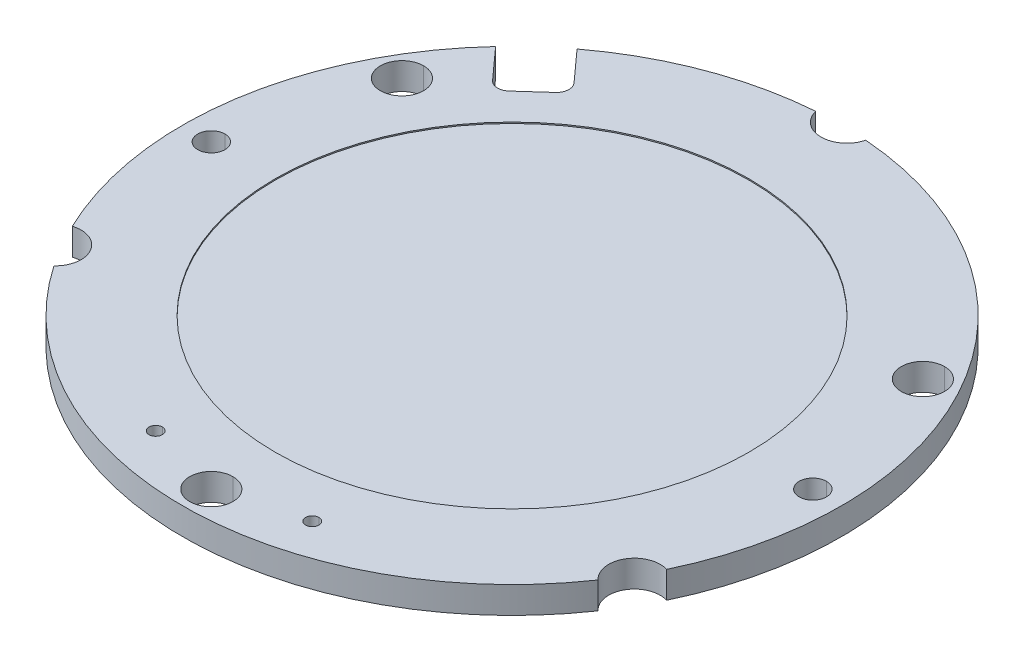
ISO-10303-21;
HEADER;
FILE_DESCRIPTION(('STEP AP214'),'2;1');
FILE_NAME('part.step','',(''),(''),'','','');
FILE_SCHEMA(('AUTOMOTIVE_DESIGN { 1 0 10303 214 1 1 1 1 }'));
ENDSEC;
DATA;
#1=APPLICATION_CONTEXT('core data for automotive mechanical design processes');
#2=APPLICATION_PROTOCOL_DEFINITION('international standard','automotive_design',2000,#1);
#3=PRODUCT_CONTEXT('',#1,'mechanical');
#4=PRODUCT('Part','Part','',(#3));
#5=PRODUCT_RELATED_PRODUCT_CATEGORY('part','',(#4));
#6=PRODUCT_DEFINITION_FORMATION('','',#4);
#7=PRODUCT_DEFINITION_CONTEXT('part definition',#1,'design');
#8=PRODUCT_DEFINITION('design','',#6,#7);
#9=PRODUCT_DEFINITION_SHAPE('','',#8);
#10=(LENGTH_UNIT() NAMED_UNIT(*) SI_UNIT(.MILLI.,.METRE.));
#11=(NAMED_UNIT(*) PLANE_ANGLE_UNIT() SI_UNIT($,.RADIAN.));
#12=(NAMED_UNIT(*) SI_UNIT($,.STERADIAN.) SOLID_ANGLE_UNIT());
#13=UNCERTAINTY_MEASURE_WITH_UNIT(LENGTH_MEASURE(1.E-05),#10,'distance_accuracy_value','');
#14=(GEOMETRIC_REPRESENTATION_CONTEXT(3) GLOBAL_UNCERTAINTY_ASSIGNED_CONTEXT((#13)) GLOBAL_UNIT_ASSIGNED_CONTEXT((#10,
#11,#12)) REPRESENTATION_CONTEXT('',''));
#15=CARTESIAN_POINT('',(0.,0.,0.));
#16=DIRECTION('',(0.,0.,1.));
#17=DIRECTION('',(1.,0.,0.));
#18=AXIS2_PLACEMENT_3D('',#15,#16,#17);
#19=CARTESIAN_POINT('',(0.,6.5,0.));
#20=DIRECTION('',(0.,-1.,0.));
#21=DIRECTION('',(0.988564060881406,0.,0.150801517013803));
#22=AXIS2_PLACEMENT_3D('',#19,#20,#21);
#23=CYLINDRICAL_SURFACE('',#22,80.);
#24=DIRECTION('',(0.,1.,0.));
#25=VECTOR('',#24,1.);
#26=CARTESIAN_POINT('',(-58.5271472980388,6.5,-54.5396463974022));
#27=LINE('',#26,#25);
#28=CARTESIAN_POINT('',(-58.5271472980389,0.,-54.5396463974022));
#29=VERTEX_POINT('',#28);
#30=CARTESIAN_POINT('',(-58.5271472980389,6.5,-54.5396463974022));
#31=VERTEX_POINT('',#30);
#32=EDGE_CURVE('E11',#29,#31,#27,.T.);
#33=ORIENTED_EDGE('',*,*,#32,.F.);
#34=CARTESIAN_POINT('',(0.,0.,0.));
#35=DIRECTION('',(0.,1.,0.));
#36=DIRECTION('',(1.,0.,0.));
#37=AXIS2_PLACEMENT_3D('',#34,#35,#36);
#38=CIRCLE('',#37,80.);
#39=CARTESIAN_POINT('',(-72.1264135417385,0.,34.608965162312));
#40=VERTEX_POINT('',#39);
#41=EDGE_CURVE('E25',#29,#40,#38,.T.);
#42=ORIENTED_EDGE('',*,*,#41,.T.);
#43=DIRECTION('',(0.,-1.,0.));
#44=VECTOR('',#43,1.);
#45=CARTESIAN_POINT('',(-72.1264135417385,3.25,34.6089651623119));
#46=LINE('',#45,#44);
#47=CARTESIAN_POINT('',(-72.1264135417385,6.5,34.6089651623119));
#48=VERTEX_POINT('',#47);
#49=EDGE_CURVE('E584',#48,#40,#46,.T.);
#50=ORIENTED_EDGE('',*,*,#49,.F.);
#51=CARTESIAN_POINT('',(0.,6.5,0.));
#52=DIRECTION('',(0.,1.,0.));
#53=DIRECTION('',(1.,0.,0.));
#54=AXIS2_PLACEMENT_3D('',#51,#52,#53);
#55=CIRCLE('',#54,80.);
#56=EDGE_CURVE('E579',#31,#48,#55,.T.);
#57=ORIENTED_EDGE('',*,*,#56,.F.);
#58=EDGE_LOOP('',(#33,#42,#50,#57));
#59=FACE_BOUND('',#58,.T.);
#60=ADVANCED_FACE('F17',(#59),#23,.T.);
#61=CARTESIAN_POINT('',(0.,6.5,0.));
#62=DIRECTION('',(0.,1.,0.));
#63=DIRECTION('',(0.,0.,1.));
#64=AXIS2_PLACEMENT_3D('',#61,#62,#63);
#65=PLANE('',#64);
#66=CARTESIAN_POINT('',(-19.,6.5,67.5));
#67=DIRECTION('',(0.,-1.,0.));
#68=DIRECTION('',(0.,0.,-1.));
#69=AXIS2_PLACEMENT_3D('',#66,#67,#68);
#70=CIRCLE('',#69,1.621);
#71=CARTESIAN_POINT('',(-19.,6.5,65.879));
#72=VERTEX_POINT('',#71);
#73=CARTESIAN_POINT('',(-19.,6.5,69.121));
#74=VERTEX_POINT('',#73);
#75=EDGE_CURVE('E575',#72,#74,#70,.T.);
#76=ORIENTED_EDGE('',*,*,#75,.T.);
#77=CARTESIAN_POINT('',(-19.,6.5,67.5));
#78=DIRECTION('',(0.,-1.,0.));
#79=DIRECTION('',(0.,0.,-1.));
#80=AXIS2_PLACEMENT_3D('',#77,#78,#79);
#81=CIRCLE('',#80,1.621);
#82=EDGE_CURVE('E571',#74,#72,#81,.T.);
#83=ORIENTED_EDGE('',*,*,#82,.T.);
#84=EDGE_LOOP('',(#76,#83));
#85=FACE_BOUND('',#84,.T.);
#86=CARTESIAN_POINT('',(19.,6.5,67.5));
#87=DIRECTION('',(0.,-1.,0.));
#88=DIRECTION('',(0.,0.,-1.));
#89=AXIS2_PLACEMENT_3D('',#86,#87,#88);
#90=CIRCLE('',#89,1.621);
#91=CARTESIAN_POINT('',(19.,6.5,65.879));
#92=VERTEX_POINT('',#91);
#93=CARTESIAN_POINT('',(19.,6.5,69.121));
#94=VERTEX_POINT('',#93);
#95=EDGE_CURVE('E567',#92,#94,#90,.T.);
#96=ORIENTED_EDGE('',*,*,#95,.T.);
#97=CARTESIAN_POINT('',(19.,6.5,67.5));
#98=DIRECTION('',(0.,-1.,0.));
#99=DIRECTION('',(0.,0.,-1.));
#100=AXIS2_PLACEMENT_3D('',#97,#98,#99);
#101=CIRCLE('',#100,1.621);
#102=EDGE_CURVE('E563',#94,#92,#101,.T.);
#103=ORIENTED_EDGE('',*,*,#102,.T.);
#104=EDGE_LOOP('',(#96,#103));
#105=FACE_BOUND('',#104,.T.);
#106=CARTESIAN_POINT('',(-63.22,6.5,-36.5));
#107=DIRECTION('',(0.,1.,0.));
#108=DIRECTION('',(1.,0.,0.));
#109=AXIS2_PLACEMENT_3D('',#106,#107,#108);
#110=CIRCLE('',#109,5.25);
#111=CARTESIAN_POINT('',(-63.22,6.5,-41.75));
#112=VERTEX_POINT('',#111);
#113=CARTESIAN_POINT('',(-63.22,6.5,-31.25));
#114=VERTEX_POINT('',#113);
#115=EDGE_CURVE('E558',#112,#114,#110,.T.);
#116=ORIENTED_EDGE('',*,*,#115,.F.);
#117=CARTESIAN_POINT('',(-63.22,6.5,-36.5));
#118=DIRECTION('',(0.,1.,0.));
#119=DIRECTION('',(0.,0.,1.));
#120=AXIS2_PLACEMENT_3D('',#117,#118,#119);
#121=CIRCLE('',#120,5.25);
#122=EDGE_CURVE('E553',#114,#112,#121,.T.);
#123=ORIENTED_EDGE('',*,*,#122,.F.);
#124=EDGE_LOOP('',(#116,#123));
#125=FACE_BOUND('',#124,.T.);
#126=CARTESIAN_POINT('',(63.22,6.5,-36.5));
#127=DIRECTION('',(0.,1.,0.));
#128=DIRECTION('',(1.,0.,0.));
#129=AXIS2_PLACEMENT_3D('',#126,#127,#128);
#130=CIRCLE('',#129,5.25);
#131=CARTESIAN_POINT('',(63.22,6.5,-41.75));
#132=VERTEX_POINT('',#131);
#133=CARTESIAN_POINT('',(63.22,6.5,-31.25));
#134=VERTEX_POINT('',#133);
#135=EDGE_CURVE('E548',#132,#134,#130,.T.);
#136=ORIENTED_EDGE('',*,*,#135,.F.);
#137=CARTESIAN_POINT('',(63.22,6.5,-36.5));
#138=DIRECTION('',(0.,1.,0.));
#139=DIRECTION('',(0.,0.,1.));
#140=AXIS2_PLACEMENT_3D('',#137,#138,#139);
#141=CIRCLE('',#140,5.25);
#142=EDGE_CURVE('E543',#134,#132,#141,.T.);
#143=ORIENTED_EDGE('',*,*,#142,.F.);
#144=EDGE_LOOP('',(#136,#143));
#145=FACE_BOUND('',#144,.T.);
#146=CARTESIAN_POINT('',(0.,6.5,73.));
#147=DIRECTION('',(0.,1.,0.));
#148=DIRECTION('',(1.,0.,0.));
#149=AXIS2_PLACEMENT_3D('',#146,#147,#148);
#150=CIRCLE('',#149,5.25);
#151=CARTESIAN_POINT('',(0.,6.5,67.75));
#152=VERTEX_POINT('',#151);
#153=CARTESIAN_POINT('',(0.,6.5,78.25));
#154=VERTEX_POINT('',#153);
#155=EDGE_CURVE('E538',#152,#154,#150,.T.);
#156=ORIENTED_EDGE('',*,*,#155,.F.);
#157=CARTESIAN_POINT('',(0.,6.5,73.));
#158=DIRECTION('',(0.,1.,0.));
#159=DIRECTION('',(0.,0.,1.));
#160=AXIS2_PLACEMENT_3D('',#157,#158,#159);
#161=CIRCLE('',#160,5.25);
#162=EDGE_CURVE('E533',#154,#152,#161,.T.);
#163=ORIENTED_EDGE('',*,*,#162,.F.);
#164=EDGE_LOOP('',(#156,#163));
#165=FACE_BOUND('',#164,.T.);
#166=CARTESIAN_POINT('',(-73.,6.5,0.));
#167=DIRECTION('',(0.,-1.,0.));
#168=DIRECTION('',(0.,0.,-1.));
#169=AXIS2_PLACEMENT_3D('',#166,#167,#168);
#170=CIRCLE('',#169,3.3);
#171=CARTESIAN_POINT('',(-73.,6.5,-3.3));
#172=VERTEX_POINT('',#171);
#173=CARTESIAN_POINT('',(-73.,6.5,3.3));
#174=VERTEX_POINT('',#173);
#175=EDGE_CURVE('E529',#172,#174,#170,.T.);
#176=ORIENTED_EDGE('',*,*,#175,.T.);
#177=CARTESIAN_POINT('',(-73.,6.5,0.));
#178=DIRECTION('',(0.,-1.,0.));
#179=DIRECTION('',(0.,0.,-1.));
#180=AXIS2_PLACEMENT_3D('',#177,#178,#179);
#181=CIRCLE('',#180,3.3);
#182=EDGE_CURVE('E525',#174,#172,#181,.T.);
#183=ORIENTED_EDGE('',*,*,#182,.T.);
#184=EDGE_LOOP('',(#176,#183));
#185=FACE_BOUND('',#184,.T.);
#186=CARTESIAN_POINT('',(73.,6.5,0.));
#187=DIRECTION('',(0.,-1.,0.));
#188=DIRECTION('',(0.,0.,-1.));
#189=AXIS2_PLACEMENT_3D('',#186,#187,#188);
#190=CIRCLE('',#189,3.3);
#191=CARTESIAN_POINT('',(73.,6.5,-3.3));
#192=VERTEX_POINT('',#191);
#193=CARTESIAN_POINT('',(73.,6.5,3.3));
#194=VERTEX_POINT('',#193);
#195=EDGE_CURVE('E521',#192,#194,#190,.T.);
#196=ORIENTED_EDGE('',*,*,#195,.T.);
#197=CARTESIAN_POINT('',(73.,6.5,0.));
#198=DIRECTION('',(0.,-1.,0.));
#199=DIRECTION('',(0.,0.,-1.));
#200=AXIS2_PLACEMENT_3D('',#197,#198,#199);
#201=CIRCLE('',#200,3.3);
#202=EDGE_CURVE('E517',#194,#192,#201,.T.);
#203=ORIENTED_EDGE('',*,*,#202,.T.);
#204=EDGE_LOOP('',(#196,#203));
#205=FACE_BOUND('',#204,.T.);
#206=CARTESIAN_POINT('',(0.,6.5,0.));
#207=DIRECTION('',(0.,1.,0.));
#208=DIRECTION('',(1.,0.,0.));
#209=AXIS2_PLACEMENT_3D('',#206,#207,#208);
#210=CIRCLE('',#209,57.5);
#211=CARTESIAN_POINT('',(0.,6.5,-57.5));
#212=VERTEX_POINT('',#211);
#213=CARTESIAN_POINT('',(0.,6.5,57.5));
#214=VERTEX_POINT('',#213);
#215=EDGE_CURVE('E212',#212,#214,#210,.T.);
#216=ORIENTED_EDGE('',*,*,#215,.F.);
#217=CARTESIAN_POINT('',(0.,6.5,0.));
#218=DIRECTION('',(0.,1.,0.));
#219=DIRECTION('',(0.,0.,1.));
#220=AXIS2_PLACEMENT_3D('',#217,#218,#219);
#221=CIRCLE('',#220,57.5);
#222=EDGE_CURVE('E510',#214,#212,#221,.T.);
#223=ORIENTED_EDGE('',*,*,#222,.F.);
#224=EDGE_LOOP('',(#216,#223));
#225=FACE_BOUND('',#224,.T.);
#226=CARTESIAN_POINT('',(-49.5440695044861,6.5,-49.0463574277883));
#227=DIRECTION('',(0.,1.,0.));
#228=DIRECTION('',(1.,0.,0.));
#229=AXIS2_PLACEMENT_3D('',#226,#227,#228);
#230=CIRCLE('',#229,2.99999999999755);
#231=CARTESIAN_POINT('',(-51.773503980918,6.5,-47.038965608715));
#232=VERTEX_POINT('',#231);
#233=CARTESIAN_POINT('',(-47.53667768541,6.5,-46.816922951359));
#234=VERTEX_POINT('',#233);
#235=EDGE_CURVE('E505',#232,#234,#230,.T.);
#236=ORIENTED_EDGE('',*,*,#235,.F.);
#237=DIRECTION('',(0.669130606358847,0.,0.743144825477405));
#238=VECTOR('',#237,1.);
#239=CARTESIAN_POINT('',(-58.73246228705,6.5,-54.76767179368));
#240=LINE('',#239,#238);
#241=EDGE_CURVE('E500',#31,#232,#240,.T.);
#242=ORIENTED_EDGE('',*,*,#241,.F.);
#243=ORIENTED_EDGE('',*,*,#56,.T.);
#244=CARTESIAN_POINT('',(-70.28,6.5,40.58));
#245=DIRECTION('',(0.,1.,0.));
#246=DIRECTION('',(1.,0.,0.));
#247=AXIS2_PLACEMENT_3D('',#244,#245,#246);
#248=CIRCLE('',#247,6.25);
#249=CARTESIAN_POINT('',(-66.031764852273,6.5,45.1642118329781));
#250=VERTEX_POINT('',#249);
#251=EDGE_CURVE('E495',#250,#48,#248,.T.);
#252=ORIENTED_EDGE('',*,*,#251,.F.);
#253=CARTESIAN_POINT('',(0.,6.5,0.));
#254=DIRECTION('',(0.,1.,0.));
#255=DIRECTION('',(1.,0.,0.));
#256=AXIS2_PLACEMENT_3D('',#253,#254,#255);
#257=CIRCLE('',#256,80.);
#258=CARTESIAN_POINT('',(66.031764852273,6.5,45.1642118329781));
#259=VERTEX_POINT('',#258);
#260=EDGE_CURVE('E491',#250,#259,#257,.T.);
#261=ORIENTED_EDGE('',*,*,#260,.T.);
#262=CARTESIAN_POINT('',(70.28,6.5,40.58));
#263=DIRECTION('',(0.,1.,0.));
#264=DIRECTION('',(1.,0.,0.));
#265=AXIS2_PLACEMENT_3D('',#262,#263,#264);
#266=CIRCLE('',#265,6.25);
#267=CARTESIAN_POINT('',(72.1264135417385,6.5,34.6089651623119));
#268=VERTEX_POINT('',#267);
#269=EDGE_CURVE('E486',#268,#259,#266,.T.);
#270=ORIENTED_EDGE('',*,*,#269,.F.);
#271=CARTESIAN_POINT('',(0.,6.5,0.));
#272=DIRECTION('',(0.,1.,0.));
#273=DIRECTION('',(1.,0.,0.));
#274=AXIS2_PLACEMENT_3D('',#271,#272,#273);
#275=CIRCLE('',#274,80.);
#276=CARTESIAN_POINT('',(6.07205257595874,6.5,-79.7692307692308));
#277=VERTEX_POINT('',#276);
#278=EDGE_CURVE('E482',#268,#277,#275,.T.);
#279=ORIENTED_EDGE('',*,*,#278,.T.);
#280=CARTESIAN_POINT('',(0.,6.5,-81.25));
#281=DIRECTION('',(0.,1.,0.));
#282=DIRECTION('',(1.,0.,0.));
#283=AXIS2_PLACEMENT_3D('',#280,#281,#282);
#284=CIRCLE('',#283,6.25);
#285=CARTESIAN_POINT('',(-6.07205257595874,6.5,-79.7692307692308));
#286=VERTEX_POINT('',#285);
#287=EDGE_CURVE('E477',#286,#277,#284,.T.);
#288=ORIENTED_EDGE('',*,*,#287,.F.);
#289=CARTESIAN_POINT('',(0.,6.5,0.));
#290=DIRECTION('',(0.,1.,0.));
#291=DIRECTION('',(1.,0.,0.));
#292=AXIS2_PLACEMENT_3D('',#289,#290,#291);
#293=CIRCLE('',#292,80.);
#294=CARTESIAN_POINT('',(-48.1231197413556,6.5,-63.9074748864259));
#295=VERTEX_POINT('',#294);
#296=EDGE_CURVE('E473',#286,#295,#293,.T.);
#297=ORIENTED_EDGE('',*,*,#296,.T.);
#298=DIRECTION('',(-0.669130606358847,0.,-0.743144825477405));
#299=VECTOR('',#298,1.);
#300=CARTESIAN_POINT('',(-41.369476424235,6.5,-56.406794097739));
#301=LINE('',#300,#299);
#302=CARTESIAN_POINT('',(-41.369476424235,6.5,-56.406794097739));
#303=VERTEX_POINT('',#302);
#304=EDGE_CURVE('E468',#303,#295,#301,.T.);
#305=ORIENTED_EDGE('',*,*,#304,.F.);
#306=CARTESIAN_POINT('',(-43.5989109006665,6.5,-54.399402278662));
#307=DIRECTION('',(0.,1.,0.));
#308=DIRECTION('',(1.,0.,0.));
#309=AXIS2_PLACEMENT_3D('',#306,#307,#308);
#310=CIRCLE('',#309,2.99999999999981);
#311=CARTESIAN_POINT('',(-41.59151908159,6.5,-52.16996780223));
#312=VERTEX_POINT('',#311);
#313=EDGE_CURVE('E463',#312,#303,#310,.T.);
#314=ORIENTED_EDGE('',*,*,#313,.F.);
#315=DIRECTION('',(0.743144825477433,0.,-0.669130606358815));
#316=VECTOR('',#315,1.);
#317=CARTESIAN_POINT('',(-47.53667768541,6.5,-46.816922951359));
#318=LINE('',#317,#316);
#319=EDGE_CURVE('E458',#234,#312,#318,.T.);
#320=ORIENTED_EDGE('',*,*,#319,.F.);
#321=EDGE_LOOP('',(#236,#242,#243,#252,#261,#270,#279,#288,#297,#305,#314,#320));
#322=FACE_BOUND('',#321,.T.);
#323=ADVANCED_FACE('F597',(#85,#105,#125,#145,#165,#185,#205,#225,#322),#65,.T.);
#324=CARTESIAN_POINT('',(-47.53667768541,6.5,-46.816922951359));
#325=DIRECTION('',(-0.669130606358815,0.,-0.743144825477433));
#326=DIRECTION('',(-0.743144825477433,0.,0.669130606358815));
#327=AXIS2_PLACEMENT_3D('',#324,#325,#326);
#328=PLANE('',#327);
#329=DIRECTION('',(0.743144825477433,0.,-0.669130606358815));
#330=VECTOR('',#329,1.);
#331=CARTESIAN_POINT('',(-47.53667768541,0.,-46.816922951359));
#332=LINE('',#331,#330);
#333=CARTESIAN_POINT('',(-47.53667768541,0.,-46.816922951359));
#334=VERTEX_POINT('',#333);
#335=CARTESIAN_POINT('',(-41.59151908159,0.,-52.16996780223));
#336=VERTEX_POINT('',#335);
#337=EDGE_CURVE('E453',#334,#336,#332,.T.);
#338=ORIENTED_EDGE('',*,*,#337,.F.);
#339=DIRECTION('',(0.,-1.,0.));
#340=VECTOR('',#339,1.);
#341=CARTESIAN_POINT('',(-47.53667768541,6.5,-46.816922951359));
#342=LINE('',#341,#340);
#343=EDGE_CURVE('E448',#234,#334,#342,.T.);
#344=ORIENTED_EDGE('',*,*,#343,.F.);
#345=ORIENTED_EDGE('',*,*,#319,.T.);
#346=DIRECTION('',(0.,-1.,0.));
#347=VECTOR('',#346,1.);
#348=CARTESIAN_POINT('',(-41.59151908159,6.5,-52.16996780223));
#349=LINE('',#348,#347);
#350=EDGE_CURVE('E444',#312,#336,#349,.T.);
#351=ORIENTED_EDGE('',*,*,#350,.T.);
#352=EDGE_LOOP('',(#338,#344,#345,#351));
#353=FACE_BOUND('',#352,.T.);
#354=ADVANCED_FACE('F635',(#353),#328,.T.);
#355=CARTESIAN_POINT('',(-43.5989109006665,6.5,-54.399402278662));
#356=DIRECTION('',(0.,-1.,0.));
#357=DIRECTION('',(-0.998629535122369,0.,-0.0523359492249952));
#358=AXIS2_PLACEMENT_3D('',#355,#356,#357);
#359=CYLINDRICAL_SURFACE('',#358,2.99999999999981);
#360=CARTESIAN_POINT('',(-43.5989109006665,0.,-54.399402278662));
#361=DIRECTION('',(0.,1.,0.));
#362=DIRECTION('',(1.,0.,0.));
#363=AXIS2_PLACEMENT_3D('',#360,#361,#362);
#364=CIRCLE('',#363,2.99999999999981);
#365=CARTESIAN_POINT('',(-41.369476424235,0.,-56.406794097739));
#366=VERTEX_POINT('',#365);
#367=EDGE_CURVE('E439',#336,#366,#364,.T.);
#368=ORIENTED_EDGE('',*,*,#367,.F.);
#369=ORIENTED_EDGE('',*,*,#350,.F.);
#370=ORIENTED_EDGE('',*,*,#313,.T.);
#371=DIRECTION('',(0.,-1.,0.));
#372=VECTOR('',#371,1.);
#373=CARTESIAN_POINT('',(-41.369476424235,6.5,-56.406794097739));
#374=LINE('',#373,#372);
#375=EDGE_CURVE('E435',#303,#366,#374,.T.);
#376=ORIENTED_EDGE('',*,*,#375,.T.);
#377=EDGE_LOOP('',(#368,#369,#370,#376));
#378=FACE_BOUND('',#377,.T.);
#379=ADVANCED_FACE('F632',(#378),#359,.F.);
#380=CARTESIAN_POINT('',(-41.369476424235,6.5,-56.406794097739));
#381=DIRECTION('',(-0.743144825477405,0.,0.669130606358847));
#382=DIRECTION('',(0.669130606358847,0.,0.743144825477405));
#383=AXIS2_PLACEMENT_3D('',#380,#381,#382);
#384=PLANE('',#383);
#385=DIRECTION('',(0.,-1.,0.));
#386=VECTOR('',#385,1.);
#387=CARTESIAN_POINT('',(-48.1231197413556,6.5,-63.9074748864259));
#388=LINE('',#387,#386);
#389=CARTESIAN_POINT('',(-48.1231197413556,0.,-63.9074748864259));
#390=VERTEX_POINT('',#389);
#391=EDGE_CURVE('E431',#295,#390,#388,.T.);
#392=ORIENTED_EDGE('',*,*,#391,.T.);
#393=DIRECTION('',(-0.669130606358847,0.,-0.743144825477405));
#394=VECTOR('',#393,1.);
#395=CARTESIAN_POINT('',(-41.369476424235,0.,-56.406794097739));
#396=LINE('',#395,#394);
#397=EDGE_CURVE('E426',#366,#390,#396,.T.);
#398=ORIENTED_EDGE('',*,*,#397,.F.);
#399=ORIENTED_EDGE('',*,*,#375,.F.);
#400=ORIENTED_EDGE('',*,*,#304,.T.);
#401=EDGE_LOOP('',(#392,#398,#399,#400));
#402=FACE_BOUND('',#401,.T.);
#403=ADVANCED_FACE('F629',(#402),#384,.T.);
#404=CARTESIAN_POINT('',(0.,0.,0.));
#405=DIRECTION('',(0.,1.,0.));
#406=DIRECTION('',(0.,0.,1.));
#407=AXIS2_PLACEMENT_3D('',#404,#405,#406);
#408=PLANE('',#407);
#409=CARTESIAN_POINT('',(73.,0.,0.));
#410=DIRECTION('',(0.,-1.,0.));
#411=DIRECTION('',(0.,0.,-1.));
#412=AXIS2_PLACEMENT_3D('',#409,#410,#411);
#413=CIRCLE('',#412,3.3);
#414=CARTESIAN_POINT('',(73.,0.,3.3));
#415=VERTEX_POINT('',#414);
#416=CARTESIAN_POINT('',(73.,0.,-3.3));
#417=VERTEX_POINT('',#416);
#418=EDGE_CURVE('E421',#415,#417,#413,.T.);
#419=ORIENTED_EDGE('',*,*,#418,.F.);
#420=CARTESIAN_POINT('',(73.,0.,0.));
#421=DIRECTION('',(0.,-1.,0.));
#422=DIRECTION('',(0.,0.,-1.));
#423=AXIS2_PLACEMENT_3D('',#420,#421,#422);
#424=CIRCLE('',#423,3.3);
#425=EDGE_CURVE('E416',#417,#415,#424,.T.);
#426=ORIENTED_EDGE('',*,*,#425,.F.);
#427=EDGE_LOOP('',(#419,#426));
#428=FACE_BOUND('',#427,.T.);
#429=CARTESIAN_POINT('',(-73.,0.,0.));
#430=DIRECTION('',(0.,-1.,0.));
#431=DIRECTION('',(0.,0.,-1.));
#432=AXIS2_PLACEMENT_3D('',#429,#430,#431);
#433=CIRCLE('',#432,3.3);
#434=CARTESIAN_POINT('',(-73.,0.,3.3));
#435=VERTEX_POINT('',#434);
#436=CARTESIAN_POINT('',(-73.,0.,-3.3));
#437=VERTEX_POINT('',#436);
#438=EDGE_CURVE('E411',#435,#437,#433,.T.);
#439=ORIENTED_EDGE('',*,*,#438,.F.);
#440=CARTESIAN_POINT('',(-73.,0.,0.));
#441=DIRECTION('',(0.,-1.,0.));
#442=DIRECTION('',(0.,0.,-1.));
#443=AXIS2_PLACEMENT_3D('',#440,#441,#442);
#444=CIRCLE('',#443,3.3);
#445=EDGE_CURVE('E406',#437,#435,#444,.T.);
#446=ORIENTED_EDGE('',*,*,#445,.F.);
#447=EDGE_LOOP('',(#439,#446));
#448=FACE_BOUND('',#447,.T.);
#449=CARTESIAN_POINT('',(0.,0.,73.));
#450=DIRECTION('',(0.,1.,0.));
#451=DIRECTION('',(1.,0.,0.));
#452=AXIS2_PLACEMENT_3D('',#449,#450,#451);
#453=CIRCLE('',#452,5.25);
#454=CARTESIAN_POINT('',(0.,0.,67.75));
#455=VERTEX_POINT('',#454);
#456=CARTESIAN_POINT('',(0.,0.,78.25));
#457=VERTEX_POINT('',#456);
#458=EDGE_CURVE('E402',#455,#457,#453,.T.);
#459=ORIENTED_EDGE('',*,*,#458,.T.);
#460=CARTESIAN_POINT('',(0.,0.,73.));
#461=DIRECTION('',(0.,1.,0.));
#462=DIRECTION('',(0.,0.,1.));
#463=AXIS2_PLACEMENT_3D('',#460,#461,#462);
#464=CIRCLE('',#463,5.25);
#465=EDGE_CURVE('E398',#457,#455,#464,.T.);
#466=ORIENTED_EDGE('',*,*,#465,.T.);
#467=EDGE_LOOP('',(#459,#466));
#468=FACE_BOUND('',#467,.T.);
#469=CARTESIAN_POINT('',(63.22,0.,-36.5));
#470=DIRECTION('',(0.,1.,0.));
#471=DIRECTION('',(1.,0.,0.));
#472=AXIS2_PLACEMENT_3D('',#469,#470,#471);
#473=CIRCLE('',#472,5.25);
#474=CARTESIAN_POINT('',(63.22,0.,-41.75));
#475=VERTEX_POINT('',#474);
#476=CARTESIAN_POINT('',(63.22,0.,-31.25));
#477=VERTEX_POINT('',#476);
#478=EDGE_CURVE('E394',#475,#477,#473,.T.);
#479=ORIENTED_EDGE('',*,*,#478,.T.);
#480=CARTESIAN_POINT('',(63.22,0.,-36.5));
#481=DIRECTION('',(0.,1.,0.));
#482=DIRECTION('',(0.,0.,1.));
#483=AXIS2_PLACEMENT_3D('',#480,#481,#482);
#484=CIRCLE('',#483,5.25);
#485=EDGE_CURVE('E390',#477,#475,#484,.T.);
#486=ORIENTED_EDGE('',*,*,#485,.T.);
#487=EDGE_LOOP('',(#479,#486));
#488=FACE_BOUND('',#487,.T.);
#489=CARTESIAN_POINT('',(-63.22,0.,-36.5));
#490=DIRECTION('',(0.,1.,0.));
#491=DIRECTION('',(1.,0.,0.));
#492=AXIS2_PLACEMENT_3D('',#489,#490,#491);
#493=CIRCLE('',#492,5.25);
#494=CARTESIAN_POINT('',(-63.22,0.,-41.75));
#495=VERTEX_POINT('',#494);
#496=CARTESIAN_POINT('',(-63.22,0.,-31.25));
#497=VERTEX_POINT('',#496);
#498=EDGE_CURVE('E386',#495,#497,#493,.T.);
#499=ORIENTED_EDGE('',*,*,#498,.T.);
#500=CARTESIAN_POINT('',(-63.22,0.,-36.5));
#501=DIRECTION('',(0.,1.,0.));
#502=DIRECTION('',(0.,0.,1.));
#503=AXIS2_PLACEMENT_3D('',#500,#501,#502);
#504=CIRCLE('',#503,5.25);
#505=EDGE_CURVE('E382',#497,#495,#504,.T.);
#506=ORIENTED_EDGE('',*,*,#505,.T.);
#507=EDGE_LOOP('',(#499,#506));
#508=FACE_BOUND('',#507,.T.);
#509=CARTESIAN_POINT('',(19.,0.,67.5));
#510=DIRECTION('',(0.,-1.,0.));
#511=DIRECTION('',(0.,0.,-1.));
#512=AXIS2_PLACEMENT_3D('',#509,#510,#511);
#513=CIRCLE('',#512,1.621);
#514=CARTESIAN_POINT('',(19.,0.,69.121));
#515=VERTEX_POINT('',#514);
#516=CARTESIAN_POINT('',(19.,0.,65.879));
#517=VERTEX_POINT('',#516);
#518=EDGE_CURVE('E377',#515,#517,#513,.T.);
#519=ORIENTED_EDGE('',*,*,#518,.F.);
#520=CARTESIAN_POINT('',(19.,0.,67.5));
#521=DIRECTION('',(0.,-1.,0.));
#522=DIRECTION('',(0.,0.,-1.));
#523=AXIS2_PLACEMENT_3D('',#520,#521,#522);
#524=CIRCLE('',#523,1.621);
#525=EDGE_CURVE('E372',#517,#515,#524,.T.);
#526=ORIENTED_EDGE('',*,*,#525,.F.);
#527=EDGE_LOOP('',(#519,#526));
#528=FACE_BOUND('',#527,.T.);
#529=CARTESIAN_POINT('',(-19.,0.,67.5));
#530=DIRECTION('',(0.,-1.,0.));
#531=DIRECTION('',(0.,0.,-1.));
#532=AXIS2_PLACEMENT_3D('',#529,#530,#531);
#533=CIRCLE('',#532,1.621);
#534=CARTESIAN_POINT('',(-19.,0.,69.121));
#535=VERTEX_POINT('',#534);
#536=CARTESIAN_POINT('',(-19.,0.,65.879));
#537=VERTEX_POINT('',#536);
#538=EDGE_CURVE('E367',#535,#537,#533,.T.);
#539=ORIENTED_EDGE('',*,*,#538,.F.);
#540=CARTESIAN_POINT('',(-19.,0.,67.5));
#541=DIRECTION('',(0.,-1.,0.));
#542=DIRECTION('',(0.,0.,-1.));
#543=AXIS2_PLACEMENT_3D('',#540,#541,#542);
#544=CIRCLE('',#543,1.621);
#545=EDGE_CURVE('E362',#537,#535,#544,.T.);
#546=ORIENTED_EDGE('',*,*,#545,.F.);
#547=EDGE_LOOP('',(#539,#546));
#548=FACE_BOUND('',#547,.T.);
#549=DIRECTION('',(-0.669130606358847,0.,-0.743144825477405));
#550=VECTOR('',#549,1.);
#551=CARTESIAN_POINT('',(-5.20201377834229,0.,4.68391424451234));
#552=LINE('',#551,#550);
#553=CARTESIAN_POINT('',(-51.773503980918,0.,-47.038965608715));
#554=VERTEX_POINT('',#553);
#555=EDGE_CURVE('E357',#554,#29,#552,.T.);
#556=ORIENTED_EDGE('',*,*,#555,.F.);
#557=CARTESIAN_POINT('',(-49.5440695044861,0.,-49.0463574277883));
#558=DIRECTION('',(0.,1.,0.));
#559=DIRECTION('',(1.,0.,0.));
#560=AXIS2_PLACEMENT_3D('',#557,#558,#559);
#561=CIRCLE('',#560,2.99999999999755);
#562=EDGE_CURVE('E352',#554,#334,#561,.T.);
#563=ORIENTED_EDGE('',*,*,#562,.T.);
#564=ORIENTED_EDGE('',*,*,#337,.T.);
#565=ORIENTED_EDGE('',*,*,#367,.T.);
#566=ORIENTED_EDGE('',*,*,#397,.T.);
#567=CARTESIAN_POINT('',(0.,0.,0.));
#568=DIRECTION('',(0.,1.,0.));
#569=DIRECTION('',(1.,0.,0.));
#570=AXIS2_PLACEMENT_3D('',#567,#568,#569);
#571=CIRCLE('',#570,80.);
#572=CARTESIAN_POINT('',(-6.07205257595874,0.,-79.7692307692308));
#573=VERTEX_POINT('',#572);
#574=EDGE_CURVE('E347',#573,#390,#571,.T.);
#575=ORIENTED_EDGE('',*,*,#574,.F.);
#576=CARTESIAN_POINT('',(0.,0.,-81.25));
#577=DIRECTION('',(0.,1.,0.));
#578=DIRECTION('',(1.,0.,0.));
#579=AXIS2_PLACEMENT_3D('',#576,#577,#578);
#580=CIRCLE('',#579,6.25);
#581=CARTESIAN_POINT('',(6.07205257595871,0.,-79.7692307692308));
#582=VERTEX_POINT('',#581);
#583=EDGE_CURVE('E343',#573,#582,#580,.T.);
#584=ORIENTED_EDGE('',*,*,#583,.T.);
#585=CARTESIAN_POINT('',(0.,0.,0.));
#586=DIRECTION('',(0.,1.,0.));
#587=DIRECTION('',(1.,0.,0.));
#588=AXIS2_PLACEMENT_3D('',#585,#586,#587);
#589=CIRCLE('',#588,80.);
#590=CARTESIAN_POINT('',(72.1264135417385,0.,34.6089651623119));
#591=VERTEX_POINT('',#590);
#592=EDGE_CURVE('E338',#591,#582,#589,.T.);
#593=ORIENTED_EDGE('',*,*,#592,.F.);
#594=CARTESIAN_POINT('',(70.28,0.,40.58));
#595=DIRECTION('',(0.,1.,0.));
#596=DIRECTION('',(1.,0.,0.));
#597=AXIS2_PLACEMENT_3D('',#594,#595,#596);
#598=CIRCLE('',#597,6.25);
#599=CARTESIAN_POINT('',(66.0317648522731,0.,45.1642118329781));
#600=VERTEX_POINT('',#599);
#601=EDGE_CURVE('E334',#591,#600,#598,.T.);
#602=ORIENTED_EDGE('',*,*,#601,.T.);
#603=CARTESIAN_POINT('',(0.,0.,0.));
#604=DIRECTION('',(0.,1.,0.));
#605=DIRECTION('',(1.,0.,0.));
#606=AXIS2_PLACEMENT_3D('',#603,#604,#605);
#607=CIRCLE('',#606,80.);
#608=CARTESIAN_POINT('',(-66.031764852273,0.,45.1642118329781));
#609=VERTEX_POINT('',#608);
#610=EDGE_CURVE('E329',#609,#600,#607,.T.);
#611=ORIENTED_EDGE('',*,*,#610,.F.);
#612=CARTESIAN_POINT('',(-70.28,0.,40.58));
#613=DIRECTION('',(0.,-1.,0.));
#614=DIRECTION('',(0.,0.,1.));
#615=AXIS2_PLACEMENT_3D('',#612,#613,#614);
#616=CIRCLE('',#615,6.25);
#617=EDGE_CURVE('E324',#40,#609,#616,.T.);
#618=ORIENTED_EDGE('',*,*,#617,.F.);
#619=ORIENTED_EDGE('',*,*,#41,.F.);
#620=EDGE_LOOP('',(#556,#563,#564,#565,#566,#575,#584,#593,#602,#611,#618,#619));
#621=FACE_BOUND('',#620,.T.);
#622=ADVANCED_FACE('F603',(#428,#448,#468,#488,#508,#528,#548,#621),#408,.F.);
#623=CARTESIAN_POINT('',(-70.28,6.5,40.58));
#624=DIRECTION('',(0.,-1.,0.));
#625=DIRECTION('',(-0.866005004348047,0.,0.500035331195845));
#626=AXIS2_PLACEMENT_3D('',#623,#624,#625);
#627=CYLINDRICAL_SURFACE('',#626,6.25);
#628=ORIENTED_EDGE('',*,*,#49,.T.);
#629=ORIENTED_EDGE('',*,*,#617,.T.);
#630=DIRECTION('',(0.,1.,0.));
#631=VECTOR('',#630,1.);
#632=CARTESIAN_POINT('',(-66.031764852273,3.25,45.1642118329781));
#633=LINE('',#632,#631);
#634=EDGE_CURVE('E319',#609,#250,#633,.T.);
#635=ORIENTED_EDGE('',*,*,#634,.T.);
#636=ORIENTED_EDGE('',*,*,#251,.T.);
#637=EDGE_LOOP('',(#628,#629,#635,#636));
#638=FACE_BOUND('',#637,.T.);
#639=ADVANCED_FACE('F594',(#638),#627,.F.);
#640=CARTESIAN_POINT('',(0.,6.5,0.));
#641=DIRECTION('',(0.,-1.,0.));
#642=DIRECTION('',(0.,0.,-1.));
#643=AXIS2_PLACEMENT_3D('',#640,#641,#642);
#644=CYLINDRICAL_SURFACE('',#643,80.);
#645=ORIENTED_EDGE('',*,*,#634,.F.);
#646=ORIENTED_EDGE('',*,*,#610,.T.);
#647=DIRECTION('',(0.,-1.,0.));
#648=VECTOR('',#647,1.);
#649=CARTESIAN_POINT('',(66.031764852273,3.25,45.1642118329781));
#650=LINE('',#649,#648);
#651=EDGE_CURVE('E314',#259,#600,#650,.T.);
#652=ORIENTED_EDGE('',*,*,#651,.F.);
#653=ORIENTED_EDGE('',*,*,#260,.F.);
#654=EDGE_LOOP('',(#645,#646,#652,#653));
#655=FACE_BOUND('',#654,.T.);
#656=ADVANCED_FACE('F609',(#655),#644,.T.);
#657=CARTESIAN_POINT('',(70.28,6.5,40.58));
#658=DIRECTION('',(0.,-1.,0.));
#659=DIRECTION('',(0.866005004348048,0.,0.500035331195844));
#660=AXIS2_PLACEMENT_3D('',#657,#658,#659);
#661=CYLINDRICAL_SURFACE('',#660,6.25);
#662=ORIENTED_EDGE('',*,*,#651,.T.);
#663=ORIENTED_EDGE('',*,*,#601,.F.);
#664=DIRECTION('',(0.,1.,0.));
#665=VECTOR('',#664,1.);
#666=CARTESIAN_POINT('',(72.1264135417385,3.25,34.6089651623119));
#667=LINE('',#666,#665);
#668=EDGE_CURVE('E309',#591,#268,#667,.T.);
#669=ORIENTED_EDGE('',*,*,#668,.T.);
#670=ORIENTED_EDGE('',*,*,#269,.T.);
#671=EDGE_LOOP('',(#662,#663,#669,#670));
#672=FACE_BOUND('',#671,.T.);
#673=ADVANCED_FACE('F611',(#672),#661,.F.);
#674=CARTESIAN_POINT('',(0.,6.5,0.));
#675=DIRECTION('',(0.,-1.,0.));
#676=DIRECTION('',(-0.865966125128598,0.,0.500102659590769));
#677=AXIS2_PLACEMENT_3D('',#674,#675,#676);
#678=CYLINDRICAL_SURFACE('',#677,80.);
#679=ORIENTED_EDGE('',*,*,#668,.F.);
#680=ORIENTED_EDGE('',*,*,#592,.T.);
#681=DIRECTION('',(0.,-1.,0.));
#682=VECTOR('',#681,1.);
#683=CARTESIAN_POINT('',(6.07205257595873,3.25,-79.7692307692308));
#684=LINE('',#683,#682);
#685=EDGE_CURVE('E304',#277,#582,#684,.T.);
#686=ORIENTED_EDGE('',*,*,#685,.F.);
#687=ORIENTED_EDGE('',*,*,#278,.F.);
#688=EDGE_LOOP('',(#679,#680,#686,#687));
#689=FACE_BOUND('',#688,.T.);
#690=ADVANCED_FACE('F616',(#689),#678,.T.);
#691=CARTESIAN_POINT('',(0.,6.5,-81.25));
#692=DIRECTION('',(0.,-1.,0.));
#693=DIRECTION('',(0.,0.,-1.));
#694=AXIS2_PLACEMENT_3D('',#691,#692,#693);
#695=CYLINDRICAL_SURFACE('',#694,6.25);
#696=ORIENTED_EDGE('',*,*,#685,.T.);
#697=ORIENTED_EDGE('',*,*,#583,.F.);
#698=DIRECTION('',(0.,1.,0.));
#699=VECTOR('',#698,1.);
#700=CARTESIAN_POINT('',(-6.07205257595873,3.25,-79.7692307692308));
#701=LINE('',#700,#699);
#702=EDGE_CURVE('E299',#573,#286,#701,.T.);
#703=ORIENTED_EDGE('',*,*,#702,.T.);
#704=ORIENTED_EDGE('',*,*,#287,.T.);
#705=EDGE_LOOP('',(#696,#697,#703,#704));
#706=FACE_BOUND('',#705,.T.);
#707=ADVANCED_FACE('F618',(#706),#695,.F.);
#708=CARTESIAN_POINT('',(0.,6.5,0.));
#709=DIRECTION('',(0.,-1.,0.));
#710=DIRECTION('',(0.352929256419229,0.,0.935650009332213));
#711=AXIS2_PLACEMENT_3D('',#708,#709,#710);
#712=CYLINDRICAL_SURFACE('',#711,80.);
#713=ORIENTED_EDGE('',*,*,#391,.F.);
#714=ORIENTED_EDGE('',*,*,#296,.F.);
#715=ORIENTED_EDGE('',*,*,#702,.F.);
#716=ORIENTED_EDGE('',*,*,#574,.T.);
#717=EDGE_LOOP('',(#713,#714,#715,#716));
#718=FACE_BOUND('',#717,.T.);
#719=ADVANCED_FACE('F624',(#718),#712,.T.);
#720=CARTESIAN_POINT('',(-49.5440695044861,6.5,-49.0463574277883));
#721=DIRECTION('',(0.,-1.,0.));
#722=DIRECTION('',(0.0523359492252432,0.,-0.998629535122356));
#723=AXIS2_PLACEMENT_3D('',#720,#721,#722);
#724=CYLINDRICAL_SURFACE('',#723,2.99999999999755);
#725=ORIENTED_EDGE('',*,*,#562,.F.);
#726=DIRECTION('',(0.,-1.,0.));
#727=VECTOR('',#726,1.);
#728=CARTESIAN_POINT('',(-51.773503980918,6.5,-47.038965608715));
#729=LINE('',#728,#727);
#730=EDGE_CURVE('E294',#232,#554,#729,.T.);
#731=ORIENTED_EDGE('',*,*,#730,.F.);
#732=ORIENTED_EDGE('',*,*,#235,.T.);
#733=ORIENTED_EDGE('',*,*,#343,.T.);
#734=EDGE_LOOP('',(#725,#731,#732,#733));
#735=FACE_BOUND('',#734,.T.);
#736=ADVANCED_FACE('F637',(#735),#724,.F.);
#737=CARTESIAN_POINT('',(-58.73246228705,6.5,-54.76767179368));
#738=DIRECTION('',(0.743144825477405,0.,-0.669130606358847));
#739=DIRECTION('',(-0.669130606358847,0.,-0.743144825477405));
#740=AXIS2_PLACEMENT_3D('',#737,#738,#739);
#741=PLANE('',#740);
#742=ORIENTED_EDGE('',*,*,#32,.T.);
#743=ORIENTED_EDGE('',*,*,#241,.T.);
#744=ORIENTED_EDGE('',*,*,#730,.T.);
#745=ORIENTED_EDGE('',*,*,#555,.T.);
#746=EDGE_LOOP('',(#742,#743,#744,#745));
#747=FACE_BOUND('',#746,.T.);
#748=ADVANCED_FACE('F600',(#747),#741,.T.);
#749=CARTESIAN_POINT('',(-19.,0.,67.5));
#750=DIRECTION('',(0.,-1.,0.));
#751=DIRECTION('',(-1.,0.,0.));
#752=AXIS2_PLACEMENT_3D('',#749,#750,#751);
#753=CYLINDRICAL_SURFACE('',#752,1.621);
#754=DIRECTION('',(0.,-1.,0.));
#755=VECTOR('',#754,1.);
#756=CARTESIAN_POINT('',(-19.,6.5,69.121));
#757=LINE('',#756,#755);
#758=EDGE_CURVE('E289',#74,#535,#757,.T.);
#759=ORIENTED_EDGE('',*,*,#758,.F.);
#760=ORIENTED_EDGE('',*,*,#75,.F.);
#761=DIRECTION('',(0.,-1.,0.));
#762=VECTOR('',#761,1.);
#763=CARTESIAN_POINT('',(-19.,6.5,65.879));
#764=LINE('',#763,#762);
#765=EDGE_CURVE('E284',#72,#537,#764,.T.);
#766=ORIENTED_EDGE('',*,*,#765,.T.);
#767=ORIENTED_EDGE('',*,*,#545,.T.);
#768=EDGE_LOOP('',(#759,#760,#766,#767));
#769=FACE_BOUND('',#768,.T.);
#770=ADVANCED_FACE('F645',(#769),#753,.F.);
#771=CARTESIAN_POINT('',(-19.,0.,67.5));
#772=DIRECTION('',(0.,-1.,0.));
#773=DIRECTION('',(1.,0.,0.));
#774=AXIS2_PLACEMENT_3D('',#771,#772,#773);
#775=CYLINDRICAL_SURFACE('',#774,1.621);
#776=ORIENTED_EDGE('',*,*,#758,.T.);
#777=ORIENTED_EDGE('',*,*,#538,.T.);
#778=ORIENTED_EDGE('',*,*,#765,.F.);
#779=ORIENTED_EDGE('',*,*,#82,.F.);
#780=EDGE_LOOP('',(#776,#777,#778,#779));
#781=FACE_BOUND('',#780,.T.);
#782=ADVANCED_FACE('F711',(#781),#775,.F.);
#783=CARTESIAN_POINT('',(19.,0.,67.5));
#784=DIRECTION('',(0.,-1.,0.));
#785=DIRECTION('',(-1.,0.,0.));
#786=AXIS2_PLACEMENT_3D('',#783,#784,#785);
#787=CYLINDRICAL_SURFACE('',#786,1.621);
#788=DIRECTION('',(0.,-1.,0.));
#789=VECTOR('',#788,1.);
#790=CARTESIAN_POINT('',(19.,6.5,69.121));
#791=LINE('',#790,#789);
#792=EDGE_CURVE('E279',#94,#515,#791,.T.);
#793=ORIENTED_EDGE('',*,*,#792,.F.);
#794=ORIENTED_EDGE('',*,*,#95,.F.);
#795=DIRECTION('',(0.,-1.,0.));
#796=VECTOR('',#795,1.);
#797=CARTESIAN_POINT('',(19.,6.5,65.879));
#798=LINE('',#797,#796);
#799=EDGE_CURVE('E274',#92,#517,#798,.T.);
#800=ORIENTED_EDGE('',*,*,#799,.T.);
#801=ORIENTED_EDGE('',*,*,#525,.T.);
#802=EDGE_LOOP('',(#793,#794,#800,#801));
#803=FACE_BOUND('',#802,.T.);
#804=ADVANCED_FACE('F722',(#803),#787,.F.);
#805=CARTESIAN_POINT('',(19.,0.,67.5));
#806=DIRECTION('',(0.,-1.,0.));
#807=DIRECTION('',(1.,0.,0.));
#808=AXIS2_PLACEMENT_3D('',#805,#806,#807);
#809=CYLINDRICAL_SURFACE('',#808,1.621);
#810=ORIENTED_EDGE('',*,*,#792,.T.);
#811=ORIENTED_EDGE('',*,*,#518,.T.);
#812=ORIENTED_EDGE('',*,*,#799,.F.);
#813=ORIENTED_EDGE('',*,*,#102,.F.);
#814=EDGE_LOOP('',(#810,#811,#812,#813));
#815=FACE_BOUND('',#814,.T.);
#816=ADVANCED_FACE('F733',(#815),#809,.F.);
#817=CARTESIAN_POINT('',(-63.22,6.5,-36.5));
#818=DIRECTION('',(0.,-1.,0.));
#819=DIRECTION('',(-1.,0.,0.));
#820=AXIS2_PLACEMENT_3D('',#817,#818,#819);
#821=CYLINDRICAL_SURFACE('',#820,5.25);
#822=DIRECTION('',(0.,-1.,0.));
#823=VECTOR('',#822,1.);
#824=CARTESIAN_POINT('',(-63.22,6.5,-31.25));
#825=LINE('',#824,#823);
#826=EDGE_CURVE('E269',#114,#497,#825,.T.);
#827=ORIENTED_EDGE('',*,*,#826,.F.);
#828=ORIENTED_EDGE('',*,*,#122,.T.);
#829=DIRECTION('',(0.,-1.,0.));
#830=VECTOR('',#829,1.);
#831=CARTESIAN_POINT('',(-63.22,6.5,-41.75));
#832=LINE('',#831,#830);
#833=EDGE_CURVE('E264',#112,#495,#832,.T.);
#834=ORIENTED_EDGE('',*,*,#833,.T.);
#835=ORIENTED_EDGE('',*,*,#505,.F.);
#836=EDGE_LOOP('',(#827,#828,#834,#835));
#837=FACE_BOUND('',#836,.T.);
#838=ADVANCED_FACE('F744',(#837),#821,.F.);
#839=CARTESIAN_POINT('',(-63.22,6.5,-36.5));
#840=DIRECTION('',(0.,-1.,0.));
#841=DIRECTION('',(1.,0.,0.));
#842=AXIS2_PLACEMENT_3D('',#839,#840,#841);
#843=CYLINDRICAL_SURFACE('',#842,5.25);
#844=ORIENTED_EDGE('',*,*,#826,.T.);
#845=ORIENTED_EDGE('',*,*,#498,.F.);
#846=ORIENTED_EDGE('',*,*,#833,.F.);
#847=ORIENTED_EDGE('',*,*,#115,.T.);
#848=EDGE_LOOP('',(#844,#845,#846,#847));
#849=FACE_BOUND('',#848,.T.);
#850=ADVANCED_FACE('F755',(#849),#843,.F.);
#851=CARTESIAN_POINT('',(63.22,6.5,-36.5));
#852=DIRECTION('',(0.,-1.,0.));
#853=DIRECTION('',(-1.,0.,0.));
#854=AXIS2_PLACEMENT_3D('',#851,#852,#853);
#855=CYLINDRICAL_SURFACE('',#854,5.25);
#856=DIRECTION('',(0.,-1.,0.));
#857=VECTOR('',#856,1.);
#858=CARTESIAN_POINT('',(63.22,6.5,-31.25));
#859=LINE('',#858,#857);
#860=EDGE_CURVE('E259',#134,#477,#859,.T.);
#861=ORIENTED_EDGE('',*,*,#860,.F.);
#862=ORIENTED_EDGE('',*,*,#142,.T.);
#863=DIRECTION('',(0.,-1.,0.));
#864=VECTOR('',#863,1.);
#865=CARTESIAN_POINT('',(63.22,6.5,-41.75));
#866=LINE('',#865,#864);
#867=EDGE_CURVE('E254',#132,#475,#866,.T.);
#868=ORIENTED_EDGE('',*,*,#867,.T.);
#869=ORIENTED_EDGE('',*,*,#485,.F.);
#870=EDGE_LOOP('',(#861,#862,#868,#869));
#871=FACE_BOUND('',#870,.T.);
#872=ADVANCED_FACE('F766',(#871),#855,.F.);
#873=CARTESIAN_POINT('',(63.22,6.5,-36.5));
#874=DIRECTION('',(0.,-1.,0.));
#875=DIRECTION('',(1.,0.,0.));
#876=AXIS2_PLACEMENT_3D('',#873,#874,#875);
#877=CYLINDRICAL_SURFACE('',#876,5.25);
#878=ORIENTED_EDGE('',*,*,#860,.T.);
#879=ORIENTED_EDGE('',*,*,#478,.F.);
#880=ORIENTED_EDGE('',*,*,#867,.F.);
#881=ORIENTED_EDGE('',*,*,#135,.T.);
#882=EDGE_LOOP('',(#878,#879,#880,#881));
#883=FACE_BOUND('',#882,.T.);
#884=ADVANCED_FACE('F777',(#883),#877,.F.);
#885=CARTESIAN_POINT('',(0.,6.5,73.));
#886=DIRECTION('',(0.,-1.,0.));
#887=DIRECTION('',(-1.,0.,0.));
#888=AXIS2_PLACEMENT_3D('',#885,#886,#887);
#889=CYLINDRICAL_SURFACE('',#888,5.25);
#890=DIRECTION('',(0.,-1.,0.));
#891=VECTOR('',#890,1.);
#892=CARTESIAN_POINT('',(0.,6.5,78.25));
#893=LINE('',#892,#891);
#894=EDGE_CURVE('E249',#154,#457,#893,.T.);
#895=ORIENTED_EDGE('',*,*,#894,.F.);
#896=ORIENTED_EDGE('',*,*,#162,.T.);
#897=DIRECTION('',(0.,-1.,0.));
#898=VECTOR('',#897,1.);
#899=CARTESIAN_POINT('',(0.,6.5,67.75));
#900=LINE('',#899,#898);
#901=EDGE_CURVE('E244',#152,#455,#900,.T.);
#902=ORIENTED_EDGE('',*,*,#901,.T.);
#903=ORIENTED_EDGE('',*,*,#465,.F.);
#904=EDGE_LOOP('',(#895,#896,#902,#903));
#905=FACE_BOUND('',#904,.T.);
#906=ADVANCED_FACE('F788',(#905),#889,.F.);
#907=CARTESIAN_POINT('',(0.,6.5,73.));
#908=DIRECTION('',(0.,-1.,0.));
#909=DIRECTION('',(1.,0.,0.));
#910=AXIS2_PLACEMENT_3D('',#907,#908,#909);
#911=CYLINDRICAL_SURFACE('',#910,5.25);
#912=ORIENTED_EDGE('',*,*,#894,.T.);
#913=ORIENTED_EDGE('',*,*,#458,.F.);
#914=ORIENTED_EDGE('',*,*,#901,.F.);
#915=ORIENTED_EDGE('',*,*,#155,.T.);
#916=EDGE_LOOP('',(#912,#913,#914,#915));
#917=FACE_BOUND('',#916,.T.);
#918=ADVANCED_FACE('F799',(#917),#911,.F.);
#919=CARTESIAN_POINT('',(-73.,0.,0.));
#920=DIRECTION('',(0.,-1.,0.));
#921=DIRECTION('',(-1.,0.,0.));
#922=AXIS2_PLACEMENT_3D('',#919,#920,#921);
#923=CYLINDRICAL_SURFACE('',#922,3.3);
#924=DIRECTION('',(0.,-1.,0.));
#925=VECTOR('',#924,1.);
#926=CARTESIAN_POINT('',(-73.,6.5,3.3));
#927=LINE('',#926,#925);
#928=EDGE_CURVE('E239',#174,#435,#927,.T.);
#929=ORIENTED_EDGE('',*,*,#928,.F.);
#930=ORIENTED_EDGE('',*,*,#175,.F.);
#931=DIRECTION('',(0.,-1.,0.));
#932=VECTOR('',#931,1.);
#933=CARTESIAN_POINT('',(-73.,6.5,-3.3));
#934=LINE('',#933,#932);
#935=EDGE_CURVE('E234',#172,#437,#934,.T.);
#936=ORIENTED_EDGE('',*,*,#935,.T.);
#937=ORIENTED_EDGE('',*,*,#445,.T.);
#938=EDGE_LOOP('',(#929,#930,#936,#937));
#939=FACE_BOUND('',#938,.T.);
#940=ADVANCED_FACE('F810',(#939),#923,.F.);
#941=CARTESIAN_POINT('',(-73.,0.,0.));
#942=DIRECTION('',(0.,-1.,0.));
#943=DIRECTION('',(1.,0.,0.));
#944=AXIS2_PLACEMENT_3D('',#941,#942,#943);
#945=CYLINDRICAL_SURFACE('',#944,3.3);
#946=ORIENTED_EDGE('',*,*,#928,.T.);
#947=ORIENTED_EDGE('',*,*,#438,.T.);
#948=ORIENTED_EDGE('',*,*,#935,.F.);
#949=ORIENTED_EDGE('',*,*,#182,.F.);
#950=EDGE_LOOP('',(#946,#947,#948,#949));
#951=FACE_BOUND('',#950,.T.);
#952=ADVANCED_FACE('F821',(#951),#945,.F.);
#953=CARTESIAN_POINT('',(73.,0.,0.));
#954=DIRECTION('',(0.,-1.,0.));
#955=DIRECTION('',(-1.,0.,0.));
#956=AXIS2_PLACEMENT_3D('',#953,#954,#955);
#957=CYLINDRICAL_SURFACE('',#956,3.3);
#958=DIRECTION('',(0.,-1.,0.));
#959=VECTOR('',#958,1.);
#960=CARTESIAN_POINT('',(73.,6.5,3.3));
#961=LINE('',#960,#959);
#962=EDGE_CURVE('E229',#194,#415,#961,.T.);
#963=ORIENTED_EDGE('',*,*,#962,.F.);
#964=ORIENTED_EDGE('',*,*,#195,.F.);
#965=DIRECTION('',(0.,-1.,0.));
#966=VECTOR('',#965,1.);
#967=CARTESIAN_POINT('',(73.,6.5,-3.3));
#968=LINE('',#967,#966);
#969=EDGE_CURVE('E224',#192,#417,#968,.T.);
#970=ORIENTED_EDGE('',*,*,#969,.T.);
#971=ORIENTED_EDGE('',*,*,#425,.T.);
#972=EDGE_LOOP('',(#963,#964,#970,#971));
#973=FACE_BOUND('',#972,.T.);
#974=ADVANCED_FACE('F832',(#973),#957,.F.);
#975=CARTESIAN_POINT('',(73.,0.,0.));
#976=DIRECTION('',(0.,-1.,0.));
#977=DIRECTION('',(1.,0.,0.));
#978=AXIS2_PLACEMENT_3D('',#975,#976,#977);
#979=CYLINDRICAL_SURFACE('',#978,3.3);
#980=ORIENTED_EDGE('',*,*,#962,.T.);
#981=ORIENTED_EDGE('',*,*,#418,.T.);
#982=ORIENTED_EDGE('',*,*,#969,.F.);
#983=ORIENTED_EDGE('',*,*,#202,.F.);
#984=EDGE_LOOP('',(#980,#981,#982,#983));
#985=FACE_BOUND('',#984,.T.);
#986=ADVANCED_FACE('F843',(#985),#979,.F.);
#987=CARTESIAN_POINT('',(0.,6.2,0.));
#988=DIRECTION('',(0.,1.,0.));
#989=DIRECTION('',(-1.,0.,0.));
#990=AXIS2_PLACEMENT_3D('',#987,#988,#989);
#991=CYLINDRICAL_SURFACE('',#990,57.5);
#992=DIRECTION('',(0.,1.,0.));
#993=VECTOR('',#992,1.);
#994=CARTESIAN_POINT('',(0.,6.2,-57.5));
#995=LINE('',#994,#993);
#996=CARTESIAN_POINT('',(0.,6.2,-57.5));
#997=VERTEX_POINT('',#996);
#998=EDGE_CURVE('E204',#997,#212,#995,.T.);
#999=ORIENTED_EDGE('',*,*,#998,.F.);
#1000=CARTESIAN_POINT('',(0.,6.2,0.));
#1001=DIRECTION('',(0.,1.,0.));
#1002=DIRECTION('',(0.,0.,1.));
#1003=AXIS2_PLACEMENT_3D('',#1000,#1001,#1002);
#1004=CIRCLE('',#1003,57.5);
#1005=CARTESIAN_POINT('',(0.,6.2,57.5));
#1006=VERTEX_POINT('',#1005);
#1007=EDGE_CURVE('E197',#1006,#997,#1004,.T.);
#1008=ORIENTED_EDGE('',*,*,#1007,.F.);
#1009=DIRECTION('',(0.,1.,0.));
#1010=VECTOR('',#1009,1.);
#1011=CARTESIAN_POINT('',(0.,6.2,57.5));
#1012=LINE('',#1011,#1010);
#1013=EDGE_CURVE('E201',#1006,#214,#1012,.T.);
#1014=ORIENTED_EDGE('',*,*,#1013,.T.);
#1015=ORIENTED_EDGE('',*,*,#222,.T.);
#1016=EDGE_LOOP('',(#999,#1008,#1014,#1015));
#1017=FACE_BOUND('',#1016,.T.);
#1018=ADVANCED_FACE('F199',(#1017),#991,.F.);
#1019=CARTESIAN_POINT('',(0.,6.2,0.));
#1020=DIRECTION('',(0.,1.,0.));
#1021=DIRECTION('',(1.,0.,0.));
#1022=AXIS2_PLACEMENT_3D('',#1019,#1020,#1021);
#1023=CYLINDRICAL_SURFACE('',#1022,57.5);
#1024=ORIENTED_EDGE('',*,*,#998,.T.);
#1025=ORIENTED_EDGE('',*,*,#215,.T.);
#1026=ORIENTED_EDGE('',*,*,#1013,.F.);
#1027=CARTESIAN_POINT('',(0.,6.2,0.));
#1028=DIRECTION('',(0.,1.,0.));
#1029=DIRECTION('',(1.,0.,0.));
#1030=AXIS2_PLACEMENT_3D('',#1027,#1028,#1029);
#1031=CIRCLE('',#1030,57.5);
#1032=EDGE_CURVE('E211',#997,#1006,#1031,.T.);
#1033=ORIENTED_EDGE('',*,*,#1032,.F.);
#1034=EDGE_LOOP('',(#1024,#1025,#1026,#1033));
#1035=FACE_BOUND('',#1034,.T.);
#1036=ADVANCED_FACE('F210',(#1035),#1023,.F.);
#1037=CARTESIAN_POINT('',(0.,6.2,0.));
#1038=DIRECTION('',(0.,1.,0.));
#1039=DIRECTION('',(0.,0.,1.));
#1040=AXIS2_PLACEMENT_3D('',#1037,#1038,#1039);
#1041=PLANE('',#1040);
#1042=ORIENTED_EDGE('',*,*,#1007,.T.);
#1043=ORIENTED_EDGE('',*,*,#1032,.T.);
#1044=EDGE_LOOP('',(#1042,#1043));
#1045=FACE_BOUND('',#1044,.T.);
#1046=ADVANCED_FACE('F214',(#1045),#1041,.T.);
#1047=CLOSED_SHELL('',(#60,#323,#354,#379,#403,#622,#639,#656,#673,#690,#707,#719,#736,#748,
#770,#782,#804,#816,#838,#850,#872,#884,#906,#918,#940,#952,#974,#986,#1018,#1036,#1046));
#1048=MANIFOLD_SOLID_BREP('B1',#1047);
#1049=ADVANCED_BREP_SHAPE_REPRESENTATION('',(#18,#1048),#14);
#1050=SHAPE_DEFINITION_REPRESENTATION(#9,#1049);
ENDSEC;
END-ISO-10303-21;
